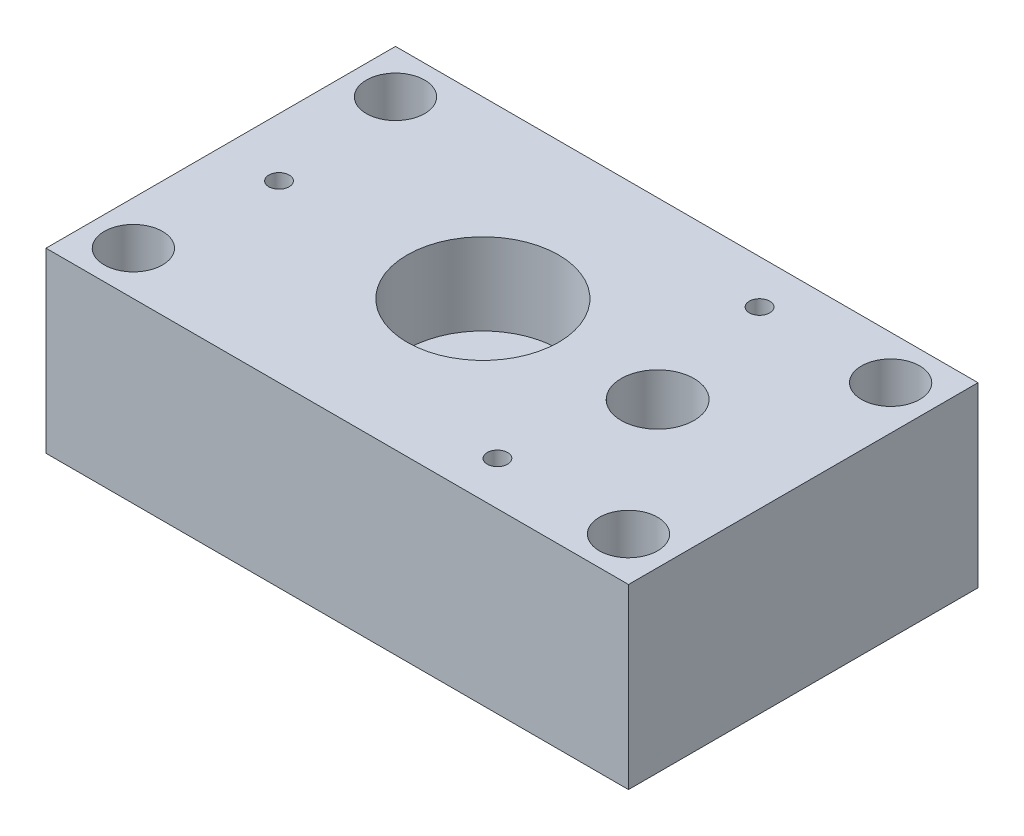
ISO-10303-21;
HEADER;
FILE_DESCRIPTION(('STEP AP214'),'2;1');
FILE_NAME('part.step','',(''),(''),'','','');
FILE_SCHEMA(('AUTOMOTIVE_DESIGN { 1 0 10303 214 1 1 1 1 }'));
ENDSEC;
DATA;
#1=APPLICATION_CONTEXT('core data for automotive mechanical design processes');
#2=APPLICATION_PROTOCOL_DEFINITION('international standard','automotive_design',2000,#1);
#3=PRODUCT_CONTEXT('',#1,'mechanical');
#4=PRODUCT('Part','Part','',(#3));
#5=PRODUCT_RELATED_PRODUCT_CATEGORY('part','',(#4));
#6=PRODUCT_DEFINITION_FORMATION('','',#4);
#7=PRODUCT_DEFINITION_CONTEXT('part definition',#1,'design');
#8=PRODUCT_DEFINITION('design','',#6,#7);
#9=PRODUCT_DEFINITION_SHAPE('','',#8);
#10=(LENGTH_UNIT() NAMED_UNIT(*) SI_UNIT(.MILLI.,.METRE.));
#11=(NAMED_UNIT(*) PLANE_ANGLE_UNIT() SI_UNIT($,.RADIAN.));
#12=(NAMED_UNIT(*) SI_UNIT($,.STERADIAN.) SOLID_ANGLE_UNIT());
#13=UNCERTAINTY_MEASURE_WITH_UNIT(LENGTH_MEASURE(1.E-05),#10,'distance_accuracy_value','');
#14=(GEOMETRIC_REPRESENTATION_CONTEXT(3) GLOBAL_UNCERTAINTY_ASSIGNED_CONTEXT((#13)) GLOBAL_UNIT_ASSIGNED_CONTEXT((#10,
#11,#12)) REPRESENTATION_CONTEXT('',''));
#15=CARTESIAN_POINT('',(0.,0.,0.));
#16=DIRECTION('',(0.,0.,1.));
#17=DIRECTION('',(1.,0.,0.));
#18=AXIS2_PLACEMENT_3D('',#15,#16,#17);
#19=CARTESIAN_POINT('',(1.5,6.1,1.5));
#20=DIRECTION('',(0.,-1.,0.));
#21=DIRECTION('',(0.,0.,-1.));
#22=AXIS2_PLACEMENT_3D('',#19,#20,#21);
#23=CYLINDRICAL_SURFACE('',#22,0.75);
#24=CARTESIAN_POINT('',(1.5,0.,1.5));
#25=DIRECTION('',(0.,1.,0.));
#26=DIRECTION('',(0.,0.,1.));
#27=AXIS2_PLACEMENT_3D('',#24,#25,#26);
#28=CIRCLE('',#27,0.75);
#29=CARTESIAN_POINT('',(1.5,0.,2.25));
#30=VERTEX_POINT('',#29);
#31=EDGE_CURVE('E265',#30,#30,#28,.T.);
#32=ORIENTED_EDGE('',*,*,#31,.F.);
#33=EDGE_LOOP('',(#32));
#34=FACE_BOUND('',#33,.T.);
#35=CARTESIAN_POINT('',(1.5,1.,1.5));
#36=DIRECTION('',(0.,1.,0.));
#37=DIRECTION('',(0.,0.,1.));
#38=AXIS2_PLACEMENT_3D('',#35,#36,#37);
#39=CIRCLE('',#38,0.75);
#40=CARTESIAN_POINT('',(1.5,1.,2.25));
#41=VERTEX_POINT('',#40);
#42=EDGE_CURVE('E131',#41,#41,#39,.T.);
#43=ORIENTED_EDGE('',*,*,#42,.T.);
#44=EDGE_LOOP('',(#43));
#45=FACE_BOUND('',#44,.T.);
#46=ADVANCED_FACE('F127',(#34,#45),#23,.F.);
#47=CARTESIAN_POINT('',(1.5,6.1,10.5));
#48=DIRECTION('',(0.,-1.,0.));
#49=DIRECTION('',(0.,0.,-1.));
#50=AXIS2_PLACEMENT_3D('',#47,#48,#49);
#51=CYLINDRICAL_SURFACE('',#50,0.75);
#52=CARTESIAN_POINT('',(1.5,0.,10.5));
#53=DIRECTION('',(0.,1.,0.));
#54=DIRECTION('',(0.,0.,1.));
#55=AXIS2_PLACEMENT_3D('',#52,#53,#54);
#56=CIRCLE('',#55,0.75);
#57=CARTESIAN_POINT('',(1.5,0.,11.25));
#58=VERTEX_POINT('',#57);
#59=EDGE_CURVE('E262',#58,#58,#56,.T.);
#60=ORIENTED_EDGE('',*,*,#59,.F.);
#61=EDGE_LOOP('',(#60));
#62=FACE_BOUND('',#61,.T.);
#63=CARTESIAN_POINT('',(1.5,1.,10.5));
#64=DIRECTION('',(0.,1.,0.));
#65=DIRECTION('',(0.,0.,1.));
#66=AXIS2_PLACEMENT_3D('',#63,#64,#65);
#67=CIRCLE('',#66,0.75);
#68=CARTESIAN_POINT('',(1.5,1.,11.25));
#69=VERTEX_POINT('',#68);
#70=EDGE_CURVE('E233',#69,#69,#67,.T.);
#71=ORIENTED_EDGE('',*,*,#70,.T.);
#72=EDGE_LOOP('',(#71));
#73=FACE_BOUND('',#72,.T.);
#74=ADVANCED_FACE('F292',(#62,#73),#51,.F.);
#75=CARTESIAN_POINT('',(18.5,6.1,1.5));
#76=DIRECTION('',(0.,-1.,0.));
#77=DIRECTION('',(0.,0.,-1.));
#78=AXIS2_PLACEMENT_3D('',#75,#76,#77);
#79=CYLINDRICAL_SURFACE('',#78,0.750000000000002);
#80=CARTESIAN_POINT('',(18.5,0.,1.5));
#81=DIRECTION('',(0.,1.,0.));
#82=DIRECTION('',(0.,0.,1.));
#83=AXIS2_PLACEMENT_3D('',#80,#81,#82);
#84=CIRCLE('',#83,0.750000000000002);
#85=CARTESIAN_POINT('',(18.5,0.,2.25));
#86=VERTEX_POINT('',#85);
#87=EDGE_CURVE('E254',#86,#86,#84,.T.);
#88=ORIENTED_EDGE('',*,*,#87,.F.);
#89=EDGE_LOOP('',(#88));
#90=FACE_BOUND('',#89,.T.);
#91=CARTESIAN_POINT('',(18.5,1.,1.5));
#92=DIRECTION('',(0.,1.,0.));
#93=DIRECTION('',(0.,0.,1.));
#94=AXIS2_PLACEMENT_3D('',#91,#92,#93);
#95=CIRCLE('',#94,0.750000000000002);
#96=CARTESIAN_POINT('',(18.5,1.,2.25));
#97=VERTEX_POINT('',#96);
#98=EDGE_CURVE('E230',#97,#97,#95,.T.);
#99=ORIENTED_EDGE('',*,*,#98,.T.);
#100=EDGE_LOOP('',(#99));
#101=FACE_BOUND('',#100,.T.);
#102=ADVANCED_FACE('F298',(#90,#101),#79,.F.);
#103=CARTESIAN_POINT('',(18.5,6.1,10.5));
#104=DIRECTION('',(0.,-1.,0.));
#105=DIRECTION('',(0.,0.,-1.));
#106=AXIS2_PLACEMENT_3D('',#103,#104,#105);
#107=CYLINDRICAL_SURFACE('',#106,0.750000000000002);
#108=CARTESIAN_POINT('',(18.5,0.,10.5));
#109=DIRECTION('',(0.,1.,0.));
#110=DIRECTION('',(0.,0.,1.));
#111=AXIS2_PLACEMENT_3D('',#108,#109,#110);
#112=CIRCLE('',#111,0.750000000000002);
#113=CARTESIAN_POINT('',(18.5,0.,11.25));
#114=VERTEX_POINT('',#113);
#115=EDGE_CURVE('E251',#114,#114,#112,.T.);
#116=ORIENTED_EDGE('',*,*,#115,.F.);
#117=EDGE_LOOP('',(#116));
#118=FACE_BOUND('',#117,.T.);
#119=CARTESIAN_POINT('',(18.5,1.,10.5));
#120=DIRECTION('',(0.,1.,0.));
#121=DIRECTION('',(0.,0.,1.));
#122=AXIS2_PLACEMENT_3D('',#119,#120,#121);
#123=CIRCLE('',#122,0.750000000000002);
#124=CARTESIAN_POINT('',(18.5,1.,11.25));
#125=VERTEX_POINT('',#124);
#126=EDGE_CURVE('E227',#125,#125,#123,.T.);
#127=ORIENTED_EDGE('',*,*,#126,.T.);
#128=EDGE_LOOP('',(#127));
#129=FACE_BOUND('',#128,.T.);
#130=ADVANCED_FACE('F304',(#118,#129),#107,.F.);
#131=CARTESIAN_POINT('',(0.,0.,0.));
#132=DIRECTION('',(0.,1.,0.));
#133=DIRECTION('',(0.,0.,1.));
#134=AXIS2_PLACEMENT_3D('',#131,#132,#133);
#135=PLANE('',#134);
#136=CARTESIAN_POINT('',(2.,0.,6.));
#137=DIRECTION('',(0.,1.,0.));
#138=DIRECTION('',(0.,0.,1.));
#139=AXIS2_PLACEMENT_3D('',#136,#137,#138);
#140=CIRCLE('',#139,0.35);
#141=CARTESIAN_POINT('',(2.,0.,6.35));
#142=VERTEX_POINT('',#141);
#143=EDGE_CURVE('E255',#142,#142,#140,.T.);
#144=ORIENTED_EDGE('',*,*,#143,.T.);
#145=EDGE_LOOP('',(#144));
#146=FACE_BOUND('',#145,.T.);
#147=ORIENTED_EDGE('',*,*,#115,.T.);
#148=EDGE_LOOP('',(#147));
#149=FACE_BOUND('',#148,.T.);
#150=ORIENTED_EDGE('',*,*,#87,.T.);
#151=EDGE_LOOP('',(#150));
#152=FACE_BOUND('',#151,.T.);
#153=ORIENTED_EDGE('',*,*,#59,.T.);
#154=EDGE_LOOP('',(#153));
#155=FACE_BOUND('',#154,.T.);
#156=CARTESIAN_POINT('',(14.,0.,1.5));
#157=DIRECTION('',(0.,1.,0.));
#158=DIRECTION('',(0.,0.,1.));
#159=AXIS2_PLACEMENT_3D('',#156,#157,#158);
#160=CIRCLE('',#159,0.350000000000001);
#161=CARTESIAN_POINT('',(14.,0.,1.85));
#162=VERTEX_POINT('',#161);
#163=EDGE_CURVE('E261',#162,#162,#160,.T.);
#164=ORIENTED_EDGE('',*,*,#163,.T.);
#165=EDGE_LOOP('',(#164));
#166=FACE_BOUND('',#165,.T.);
#167=CARTESIAN_POINT('',(14.,0.,10.5));
#168=DIRECTION('',(0.,1.,0.));
#169=DIRECTION('',(0.,0.,1.));
#170=AXIS2_PLACEMENT_3D('',#167,#168,#169);
#171=CIRCLE('',#170,0.350000000000001);
#172=CARTESIAN_POINT('',(14.,0.,10.85));
#173=VERTEX_POINT('',#172);
#174=EDGE_CURVE('E242',#173,#173,#171,.T.);
#175=ORIENTED_EDGE('',*,*,#174,.T.);
#176=EDGE_LOOP('',(#175));
#177=FACE_BOUND('',#176,.T.);
#178=ORIENTED_EDGE('',*,*,#31,.T.);
#179=EDGE_LOOP('',(#178));
#180=FACE_BOUND('',#179,.T.);
#181=DIRECTION('',(0.,0.,1.));
#182=VECTOR('',#181,1.);
#183=CARTESIAN_POINT('',(0.,0.,0.));
#184=LINE('',#183,#182);
#185=CARTESIAN_POINT('',(0.,0.,0.));
#186=VERTEX_POINT('',#185);
#187=CARTESIAN_POINT('',(0.,0.,12.));
#188=VERTEX_POINT('',#187);
#189=EDGE_CURVE('E215',#186,#188,#184,.T.);
#190=ORIENTED_EDGE('',*,*,#189,.F.);
#191=DIRECTION('',(1.,0.,0.));
#192=VECTOR('',#191,1.);
#193=CARTESIAN_POINT('',(0.,0.,0.));
#194=LINE('',#193,#192);
#195=CARTESIAN_POINT('',(20.,0.,0.));
#196=VERTEX_POINT('',#195);
#197=EDGE_CURVE('E221',#186,#196,#194,.T.);
#198=ORIENTED_EDGE('',*,*,#197,.T.);
#199=DIRECTION('',(0.,0.,1.));
#200=VECTOR('',#199,1.);
#201=CARTESIAN_POINT('',(20.,0.,0.));
#202=LINE('',#201,#200);
#203=CARTESIAN_POINT('',(20.,0.,12.));
#204=VERTEX_POINT('',#203);
#205=EDGE_CURVE('E176',#196,#204,#202,.T.);
#206=ORIENTED_EDGE('',*,*,#205,.T.);
#207=DIRECTION('',(1.,0.,0.));
#208=VECTOR('',#207,1.);
#209=CARTESIAN_POINT('',(0.,0.,12.));
#210=LINE('',#209,#208);
#211=EDGE_CURVE('E217',#188,#204,#210,.T.);
#212=ORIENTED_EDGE('',*,*,#211,.F.);
#213=EDGE_LOOP('',(#190,#198,#206,#212));
#214=FACE_BOUND('',#213,.T.);
#215=CARTESIAN_POINT('',(15.,0.,6.));
#216=DIRECTION('',(0.,1.,0.));
#217=DIRECTION('',(0.,0.,1.));
#218=AXIS2_PLACEMENT_3D('',#215,#216,#217);
#219=CIRCLE('',#218,1.25);
#220=CARTESIAN_POINT('',(15.,0.,7.25));
#221=VERTEX_POINT('',#220);
#222=EDGE_CURVE('E212',#221,#221,#219,.T.);
#223=ORIENTED_EDGE('',*,*,#222,.T.);
#224=EDGE_LOOP('',(#223));
#225=FACE_BOUND('',#224,.T.);
#226=CARTESIAN_POINT('',(9.84707986243722,0.,3.80741840382165));
#227=DIRECTION('',(0.,1.,0.));
#228=DIRECTION('',(0.,0.,1.));
#229=AXIS2_PLACEMENT_3D('',#226,#227,#228);
#230=CIRCLE('',#229,2.6);
#231=CARTESIAN_POINT('',(9.84707986243722,0.,6.40741840382165));
#232=VERTEX_POINT('',#231);
#233=EDGE_CURVE('E207',#232,#232,#230,.T.);
#234=ORIENTED_EDGE('',*,*,#233,.T.);
#235=EDGE_LOOP('',(#234));
#236=FACE_BOUND('',#235,.T.);
#237=CARTESIAN_POINT('',(7.67873609357972,0.,8.97058461265678));
#238=DIRECTION('',(0.,1.,0.));
#239=DIRECTION('',(0.,0.,1.));
#240=AXIS2_PLACEMENT_3D('',#237,#238,#239);
#241=CIRCLE('',#240,0.600000000000001);
#242=CARTESIAN_POINT('',(7.67873609357972,0.,9.57058461265678));
#243=VERTEX_POINT('',#242);
#244=EDGE_CURVE('E204',#243,#243,#241,.T.);
#245=ORIENTED_EDGE('',*,*,#244,.T.);
#246=EDGE_LOOP('',(#245));
#247=FACE_BOUND('',#246,.T.);
#248=ADVANCED_FACE('F315',(#146,#149,#152,#155,#166,#177,#180,#214,#225,#236,#247),#135,.F.);
#249=CARTESIAN_POINT('',(0.,2.8,0.));
#250=DIRECTION('',(1.,0.,0.));
#251=DIRECTION('',(0.,0.,-1.));
#252=AXIS2_PLACEMENT_3D('',#249,#250,#251);
#253=PLANE('',#252);
#254=ORIENTED_EDGE('',*,*,#189,.T.);
#255=DIRECTION('',(0.,-1.,0.));
#256=VECTOR('',#255,1.);
#257=CARTESIAN_POINT('',(0.,2.8,12.));
#258=LINE('',#257,#256);
#259=CARTESIAN_POINT('',(0.,6.1,12.));
#260=VERTEX_POINT('',#259);
#261=EDGE_CURVE('E136',#260,#188,#258,.T.);
#262=ORIENTED_EDGE('',*,*,#261,.F.);
#263=DIRECTION('',(0.,0.,-1.));
#264=VECTOR('',#263,1.);
#265=CARTESIAN_POINT('',(0.,6.1,0.));
#266=LINE('',#265,#264);
#267=CARTESIAN_POINT('',(0.,6.1,0.));
#268=VERTEX_POINT('',#267);
#269=EDGE_CURVE('E185',#260,#268,#266,.T.);
#270=ORIENTED_EDGE('',*,*,#269,.T.);
#271=DIRECTION('',(0.,-1.,0.));
#272=VECTOR('',#271,1.);
#273=CARTESIAN_POINT('',(0.,2.8,0.));
#274=LINE('',#273,#272);
#275=EDGE_CURVE('E144',#268,#186,#274,.T.);
#276=ORIENTED_EDGE('',*,*,#275,.T.);
#277=EDGE_LOOP('',(#254,#262,#270,#276));
#278=FACE_BOUND('',#277,.T.);
#279=ADVANCED_FACE('F129',(#278),#253,.F.);
#280=CARTESIAN_POINT('',(0.,2.8,12.));
#281=DIRECTION('',(0.,0.,-1.));
#282=DIRECTION('',(-1.,0.,0.));
#283=AXIS2_PLACEMENT_3D('',#280,#281,#282);
#284=PLANE('',#283);
#285=ORIENTED_EDGE('',*,*,#211,.T.);
#286=DIRECTION('',(0.,-1.,0.));
#287=VECTOR('',#286,1.);
#288=CARTESIAN_POINT('',(20.,2.8,12.));
#289=LINE('',#288,#287);
#290=CARTESIAN_POINT('',(20.,6.1,12.));
#291=VERTEX_POINT('',#290);
#292=EDGE_CURVE('E178',#291,#204,#289,.T.);
#293=ORIENTED_EDGE('',*,*,#292,.F.);
#294=DIRECTION('',(-1.,0.,0.));
#295=VECTOR('',#294,1.);
#296=CARTESIAN_POINT('',(0.,6.1,12.));
#297=LINE('',#296,#295);
#298=EDGE_CURVE('E190',#291,#260,#297,.T.);
#299=ORIENTED_EDGE('',*,*,#298,.T.);
#300=ORIENTED_EDGE('',*,*,#261,.T.);
#301=EDGE_LOOP('',(#285,#293,#299,#300));
#302=FACE_BOUND('',#301,.T.);
#303=ADVANCED_FACE('F415',(#302),#284,.F.);
#304=CARTESIAN_POINT('',(20.,2.8,0.));
#305=DIRECTION('',(1.,0.,0.));
#306=DIRECTION('',(0.,0.,-1.));
#307=AXIS2_PLACEMENT_3D('',#304,#305,#306);
#308=PLANE('',#307);
#309=ORIENTED_EDGE('',*,*,#205,.F.);
#310=DIRECTION('',(0.,-1.,0.));
#311=VECTOR('',#310,1.);
#312=CARTESIAN_POINT('',(20.,2.8,0.));
#313=LINE('',#312,#311);
#314=CARTESIAN_POINT('',(20.,6.1,0.));
#315=VERTEX_POINT('',#314);
#316=EDGE_CURVE('E152',#315,#196,#313,.T.);
#317=ORIENTED_EDGE('',*,*,#316,.F.);
#318=DIRECTION('',(0.,0.,-1.));
#319=VECTOR('',#318,1.);
#320=CARTESIAN_POINT('',(20.,6.1,0.));
#321=LINE('',#320,#319);
#322=EDGE_CURVE('E173',#291,#315,#321,.T.);
#323=ORIENTED_EDGE('',*,*,#322,.F.);
#324=ORIENTED_EDGE('',*,*,#292,.T.);
#325=EDGE_LOOP('',(#309,#317,#323,#324));
#326=FACE_BOUND('',#325,.T.);
#327=ADVANCED_FACE('F171',(#326),#308,.T.);
#328=CARTESIAN_POINT('',(0.,2.8,0.));
#329=DIRECTION('',(0.,0.,-1.));
#330=DIRECTION('',(-1.,0.,0.));
#331=AXIS2_PLACEMENT_3D('',#328,#329,#330);
#332=PLANE('',#331);
#333=ORIENTED_EDGE('',*,*,#197,.F.);
#334=ORIENTED_EDGE('',*,*,#275,.F.);
#335=DIRECTION('',(-1.,0.,0.));
#336=VECTOR('',#335,1.);
#337=CARTESIAN_POINT('',(0.,6.1,0.));
#338=LINE('',#337,#336);
#339=EDGE_CURVE('E181',#315,#268,#338,.T.);
#340=ORIENTED_EDGE('',*,*,#339,.F.);
#341=ORIENTED_EDGE('',*,*,#316,.T.);
#342=EDGE_LOOP('',(#333,#334,#340,#341));
#343=FACE_BOUND('',#342,.T.);
#344=ADVANCED_FACE('F182',(#343),#332,.T.);
#345=CARTESIAN_POINT('',(15.,2.8,6.));
#346=DIRECTION('',(0.,-1.,0.));
#347=DIRECTION('',(0.,0.,-1.));
#348=AXIS2_PLACEMENT_3D('',#345,#346,#347);
#349=CYLINDRICAL_SURFACE('',#348,1.25);
#350=ORIENTED_EDGE('',*,*,#222,.F.);
#351=EDGE_LOOP('',(#350));
#352=FACE_BOUND('',#351,.T.);
#353=CARTESIAN_POINT('',(15.,6.1,6.));
#354=DIRECTION('',(0.,1.,0.));
#355=DIRECTION('',(0.,0.,1.));
#356=AXIS2_PLACEMENT_3D('',#353,#354,#355);
#357=CIRCLE('',#356,1.25);
#358=CARTESIAN_POINT('',(15.,6.1,7.25));
#359=VERTEX_POINT('',#358);
#360=EDGE_CURVE('E194',#359,#359,#357,.T.);
#361=ORIENTED_EDGE('',*,*,#360,.T.);
#362=EDGE_LOOP('',(#361));
#363=FACE_BOUND('',#362,.T.);
#364=ADVANCED_FACE('F272',(#352,#363),#349,.F.);
#365=CARTESIAN_POINT('',(9.84707986243722,2.8,3.80741840382165));
#366=DIRECTION('',(0.,-1.,0.));
#367=DIRECTION('',(0.,0.,-1.));
#368=AXIS2_PLACEMENT_3D('',#365,#366,#367);
#369=CYLINDRICAL_SURFACE('',#368,2.6);
#370=CARTESIAN_POINT('',(9.84707986243722,2.8,3.80741840382165));
#371=DIRECTION('',(0.,1.,0.));
#372=DIRECTION('',(0.,0.,1.));
#373=AXIS2_PLACEMENT_3D('',#370,#371,#372);
#374=CIRCLE('',#373,2.6);
#375=CARTESIAN_POINT('',(9.84707986243722,2.8,6.40741840382165));
#376=VERTEX_POINT('',#375);
#377=EDGE_CURVE('E203',#376,#376,#374,.T.);
#378=ORIENTED_EDGE('',*,*,#377,.T.);
#379=EDGE_LOOP('',(#378));
#380=FACE_BOUND('',#379,.T.);
#381=ORIENTED_EDGE('',*,*,#233,.F.);
#382=EDGE_LOOP('',(#381));
#383=FACE_BOUND('',#382,.T.);
#384=ADVANCED_FACE('F401',(#380,#383),#369,.F.);
#385=CARTESIAN_POINT('',(7.67873609357972,2.8,8.97058461265678));
#386=DIRECTION('',(0.,-1.,0.));
#387=DIRECTION('',(0.,0.,-1.));
#388=AXIS2_PLACEMENT_3D('',#385,#386,#387);
#389=CYLINDRICAL_SURFACE('',#388,0.600000000000001);
#390=CARTESIAN_POINT('',(7.67873609357972,2.8,8.97058461265678));
#391=DIRECTION('',(0.,1.,0.));
#392=DIRECTION('',(0.,0.,1.));
#393=AXIS2_PLACEMENT_3D('',#390,#391,#392);
#394=CIRCLE('',#393,0.600000000000001);
#395=CARTESIAN_POINT('',(7.67873609357972,2.8,9.57058461265678));
#396=VERTEX_POINT('',#395);
#397=EDGE_CURVE('E200',#396,#396,#394,.T.);
#398=ORIENTED_EDGE('',*,*,#397,.T.);
#399=EDGE_LOOP('',(#398));
#400=FACE_BOUND('',#399,.T.);
#401=ORIENTED_EDGE('',*,*,#244,.F.);
#402=EDGE_LOOP('',(#401));
#403=FACE_BOUND('',#402,.T.);
#404=ADVANCED_FACE('F398',(#400,#403),#389,.F.);
#405=CARTESIAN_POINT('',(0.,2.8,0.));
#406=DIRECTION('',(0.,1.,0.));
#407=DIRECTION('',(0.,0.,1.));
#408=AXIS2_PLACEMENT_3D('',#405,#406,#407);
#409=PLANE('',#408);
#410=ORIENTED_EDGE('',*,*,#397,.F.);
#411=EDGE_LOOP('',(#410));
#412=FACE_BOUND('',#411,.T.);
#413=ADVANCED_FACE('F285',(#412),#409,.F.);
#414=ORIENTED_EDGE('',*,*,#377,.F.);
#415=EDGE_LOOP('',(#414));
#416=FACE_BOUND('',#415,.T.);
#417=ADVANCED_FACE('F275',(#416),#409,.F.);
#418=CARTESIAN_POINT('',(0.,6.1,0.));
#419=DIRECTION('',(0.,1.,0.));
#420=DIRECTION('',(0.,0.,1.));
#421=AXIS2_PLACEMENT_3D('',#418,#419,#420);
#422=PLANE('',#421);
#423=CARTESIAN_POINT('',(1.5,6.1,1.5));
#424=DIRECTION('',(0.,1.,0.));
#425=DIRECTION('',(0.,0.,1.));
#426=AXIS2_PLACEMENT_3D('',#423,#424,#425);
#427=CIRCLE('',#426,1.);
#428=CARTESIAN_POINT('',(1.5,6.1,2.5));
#429=VERTEX_POINT('',#428);
#430=EDGE_CURVE('E373',#429,#429,#427,.T.);
#431=ORIENTED_EDGE('',*,*,#430,.F.);
#432=EDGE_LOOP('',(#431));
#433=FACE_BOUND('',#432,.T.);
#434=CARTESIAN_POINT('',(1.5,6.1,10.5));
#435=DIRECTION('',(0.,1.,0.));
#436=DIRECTION('',(0.,0.,1.));
#437=AXIS2_PLACEMENT_3D('',#434,#435,#436);
#438=CIRCLE('',#437,1.);
#439=CARTESIAN_POINT('',(1.5,6.1,11.5));
#440=VERTEX_POINT('',#439);
#441=EDGE_CURVE('E367',#440,#440,#438,.T.);
#442=ORIENTED_EDGE('',*,*,#441,.F.);
#443=EDGE_LOOP('',(#442));
#444=FACE_BOUND('',#443,.T.);
#445=CARTESIAN_POINT('',(18.5,6.1,10.5));
#446=DIRECTION('',(0.,1.,0.));
#447=DIRECTION('',(0.,0.,1.));
#448=AXIS2_PLACEMENT_3D('',#445,#446,#447);
#449=CIRCLE('',#448,1.);
#450=CARTESIAN_POINT('',(18.5,6.1,11.5));
#451=VERTEX_POINT('',#450);
#452=EDGE_CURVE('E361',#451,#451,#449,.T.);
#453=ORIENTED_EDGE('',*,*,#452,.F.);
#454=EDGE_LOOP('',(#453));
#455=FACE_BOUND('',#454,.T.);
#456=CARTESIAN_POINT('',(18.5,6.1,1.5));
#457=DIRECTION('',(0.,1.,0.));
#458=DIRECTION('',(0.,0.,1.));
#459=AXIS2_PLACEMENT_3D('',#456,#457,#458);
#460=CIRCLE('',#459,1.);
#461=CARTESIAN_POINT('',(18.5,6.1,2.5));
#462=VERTEX_POINT('',#461);
#463=EDGE_CURVE('E363',#462,#462,#460,.T.);
#464=ORIENTED_EDGE('',*,*,#463,.F.);
#465=EDGE_LOOP('',(#464));
#466=FACE_BOUND('',#465,.T.);
#467=CARTESIAN_POINT('',(2.,6.1,6.));
#468=DIRECTION('',(0.,1.,0.));
#469=DIRECTION('',(0.,0.,1.));
#470=AXIS2_PLACEMENT_3D('',#467,#468,#469);
#471=CIRCLE('',#470,0.35);
#472=CARTESIAN_POINT('',(2.,6.1,6.35));
#473=VERTEX_POINT('',#472);
#474=EDGE_CURVE('E258',#473,#473,#471,.T.);
#475=ORIENTED_EDGE('',*,*,#474,.F.);
#476=EDGE_LOOP('',(#475));
#477=FACE_BOUND('',#476,.T.);
#478=CARTESIAN_POINT('',(14.,6.1,1.5));
#479=DIRECTION('',(0.,1.,0.));
#480=DIRECTION('',(0.,0.,1.));
#481=AXIS2_PLACEMENT_3D('',#478,#479,#480);
#482=CIRCLE('',#481,0.350000000000001);
#483=CARTESIAN_POINT('',(14.,6.1,1.85));
#484=VERTEX_POINT('',#483);
#485=EDGE_CURVE('E247',#484,#484,#482,.T.);
#486=ORIENTED_EDGE('',*,*,#485,.F.);
#487=EDGE_LOOP('',(#486));
#488=FACE_BOUND('',#487,.T.);
#489=CARTESIAN_POINT('',(14.,6.1,10.5));
#490=DIRECTION('',(0.,1.,0.));
#491=DIRECTION('',(0.,0.,1.));
#492=AXIS2_PLACEMENT_3D('',#489,#490,#491);
#493=CIRCLE('',#492,0.350000000000001);
#494=CARTESIAN_POINT('',(14.,6.1,10.85));
#495=VERTEX_POINT('',#494);
#496=EDGE_CURVE('E238',#495,#495,#493,.T.);
#497=ORIENTED_EDGE('',*,*,#496,.F.);
#498=EDGE_LOOP('',(#497));
#499=FACE_BOUND('',#498,.T.);
#500=CARTESIAN_POINT('',(9.,6.1,6.));
#501=DIRECTION('',(0.,1.,0.));
#502=DIRECTION('',(0.,0.,1.));
#503=AXIS2_PLACEMENT_3D('',#500,#501,#502);
#504=CIRCLE('',#503,2.6);
#505=CARTESIAN_POINT('',(9.,6.1,8.6));
#506=VERTEX_POINT('',#505);
#507=EDGE_CURVE('E191',#506,#506,#504,.T.);
#508=ORIENTED_EDGE('',*,*,#507,.F.);
#509=EDGE_LOOP('',(#508));
#510=FACE_BOUND('',#509,.T.);
#511=ORIENTED_EDGE('',*,*,#322,.T.);
#512=ORIENTED_EDGE('',*,*,#339,.T.);
#513=ORIENTED_EDGE('',*,*,#269,.F.);
#514=ORIENTED_EDGE('',*,*,#298,.F.);
#515=EDGE_LOOP('',(#511,#512,#513,#514));
#516=FACE_BOUND('',#515,.T.);
#517=ORIENTED_EDGE('',*,*,#360,.F.);
#518=EDGE_LOOP('',(#517));
#519=FACE_BOUND('',#518,.T.);
#520=ADVANCED_FACE('F187',(#433,#444,#455,#466,#477,#488,#499,#510,#516,#519),#422,.T.);
#521=CARTESIAN_POINT('',(9.,6.1,6.));
#522=DIRECTION('',(0.,-1.,0.));
#523=DIRECTION('',(0.,0.,-1.));
#524=AXIS2_PLACEMENT_3D('',#521,#522,#523);
#525=CYLINDRICAL_SURFACE('',#524,2.6);
#526=ORIENTED_EDGE('',*,*,#507,.T.);
#527=EDGE_LOOP('',(#526));
#528=FACE_BOUND('',#527,.T.);
#529=CARTESIAN_POINT('',(9.,3.3,6.));
#530=DIRECTION('',(0.,1.,0.));
#531=DIRECTION('',(0.,0.,1.));
#532=AXIS2_PLACEMENT_3D('',#529,#530,#531);
#533=CIRCLE('',#532,2.6);
#534=CARTESIAN_POINT('',(9.,3.3,8.6));
#535=VERTEX_POINT('',#534);
#536=EDGE_CURVE('E13',#535,#535,#533,.F.);
#537=ORIENTED_EDGE('',*,*,#536,.T.);
#538=EDGE_LOOP('',(#537));
#539=FACE_BOUND('',#538,.T.);
#540=ADVANCED_FACE('F274',(#528,#539),#525,.F.);
#541=CARTESIAN_POINT('',(0.,3.3,0.));
#542=DIRECTION('',(0.,1.,0.));
#543=DIRECTION('',(0.,0.,1.));
#544=AXIS2_PLACEMENT_3D('',#541,#542,#543);
#545=PLANE('',#544);
#546=ORIENTED_EDGE('',*,*,#536,.F.);
#547=EDGE_LOOP('',(#546));
#548=FACE_BOUND('',#547,.T.);
#549=ADVANCED_FACE('F282',(#548),#545,.T.);
#550=CARTESIAN_POINT('',(14.,6.1,10.5));
#551=DIRECTION('',(0.,-1.,0.));
#552=DIRECTION('',(0.,0.,-1.));
#553=AXIS2_PLACEMENT_3D('',#550,#551,#552);
#554=CYLINDRICAL_SURFACE('',#553,0.350000000000001);
#555=ORIENTED_EDGE('',*,*,#496,.T.);
#556=EDGE_LOOP('',(#555));
#557=FACE_BOUND('',#556,.T.);
#558=ORIENTED_EDGE('',*,*,#174,.F.);
#559=EDGE_LOOP('',(#558));
#560=FACE_BOUND('',#559,.T.);
#561=ADVANCED_FACE('F317',(#557,#560),#554,.F.);
#562=CARTESIAN_POINT('',(14.,6.1,1.5));
#563=DIRECTION('',(0.,-1.,0.));
#564=DIRECTION('',(0.,0.,-1.));
#565=AXIS2_PLACEMENT_3D('',#562,#563,#564);
#566=CYLINDRICAL_SURFACE('',#565,0.350000000000001);
#567=ORIENTED_EDGE('',*,*,#485,.T.);
#568=EDGE_LOOP('',(#567));
#569=FACE_BOUND('',#568,.T.);
#570=ORIENTED_EDGE('',*,*,#163,.F.);
#571=EDGE_LOOP('',(#570));
#572=FACE_BOUND('',#571,.T.);
#573=ADVANCED_FACE('F311',(#569,#572),#566,.F.);
#574=CARTESIAN_POINT('',(2.,6.1,6.));
#575=DIRECTION('',(0.,-1.,0.));
#576=DIRECTION('',(0.,0.,-1.));
#577=AXIS2_PLACEMENT_3D('',#574,#575,#576);
#578=CYLINDRICAL_SURFACE('',#577,0.35);
#579=ORIENTED_EDGE('',*,*,#474,.T.);
#580=EDGE_LOOP('',(#579));
#581=FACE_BOUND('',#580,.T.);
#582=ORIENTED_EDGE('',*,*,#143,.F.);
#583=EDGE_LOOP('',(#582));
#584=FACE_BOUND('',#583,.T.);
#585=ADVANCED_FACE('F307',(#581,#584),#578,.F.);
#586=CARTESIAN_POINT('',(18.5,-2.8284271247462,10.5));
#587=DIRECTION('',(0.,1.,0.));
#588=DIRECTION('',(0.,0.,1.));
#589=AXIS2_PLACEMENT_3D('',#586,#587,#588);
#590=CYLINDRICAL_SURFACE('',#589,1.);
#591=CARTESIAN_POINT('',(18.5,1.,10.5));
#592=DIRECTION('',(0.,1.,0.));
#593=DIRECTION('',(0.,0.,1.));
#594=AXIS2_PLACEMENT_3D('',#591,#592,#593);
#595=CIRCLE('',#594,1.);
#596=CARTESIAN_POINT('',(18.5,1.,11.5));
#597=VERTEX_POINT('',#596);
#598=EDGE_CURVE('E358',#597,#597,#595,.F.);
#599=ORIENTED_EDGE('',*,*,#598,.T.);
#600=EDGE_LOOP('',(#599));
#601=FACE_BOUND('',#600,.T.);
#602=ORIENTED_EDGE('',*,*,#452,.T.);
#603=EDGE_LOOP('',(#602));
#604=FACE_BOUND('',#603,.T.);
#605=ADVANCED_FACE('F310',(#601,#604),#590,.F.);
#606=CARTESIAN_POINT('',(0.,1.,0.));
#607=DIRECTION('',(0.,1.,0.));
#608=DIRECTION('',(0.,0.,1.));
#609=AXIS2_PLACEMENT_3D('',#606,#607,#608);
#610=PLANE('',#609);
#611=ORIENTED_EDGE('',*,*,#126,.F.);
#612=EDGE_LOOP('',(#611));
#613=FACE_BOUND('',#612,.T.);
#614=ORIENTED_EDGE('',*,*,#598,.F.);
#615=EDGE_LOOP('',(#614));
#616=FACE_BOUND('',#615,.T.);
#617=ADVANCED_FACE('F327',(#613,#616),#610,.T.);
#618=CARTESIAN_POINT('',(18.5,-2.8284271247462,1.5));
#619=DIRECTION('',(0.,1.,0.));
#620=DIRECTION('',(0.,0.,1.));
#621=AXIS2_PLACEMENT_3D('',#618,#619,#620);
#622=CYLINDRICAL_SURFACE('',#621,1.);
#623=CARTESIAN_POINT('',(18.5,1.,1.5));
#624=DIRECTION('',(0.,1.,0.));
#625=DIRECTION('',(0.,0.,1.));
#626=AXIS2_PLACEMENT_3D('',#623,#624,#625);
#627=CIRCLE('',#626,1.);
#628=CARTESIAN_POINT('',(18.5,1.,2.5));
#629=VERTEX_POINT('',#628);
#630=EDGE_CURVE('E231',#629,#629,#627,.F.);
#631=ORIENTED_EDGE('',*,*,#630,.T.);
#632=EDGE_LOOP('',(#631));
#633=FACE_BOUND('',#632,.T.);
#634=ORIENTED_EDGE('',*,*,#463,.T.);
#635=EDGE_LOOP('',(#634));
#636=FACE_BOUND('',#635,.T.);
#637=ADVANCED_FACE('F323',(#633,#636),#622,.F.);
#638=CARTESIAN_POINT('',(0.,1.,0.));
#639=DIRECTION('',(0.,1.,0.));
#640=DIRECTION('',(0.,0.,1.));
#641=AXIS2_PLACEMENT_3D('',#638,#639,#640);
#642=PLANE('',#641);
#643=ORIENTED_EDGE('',*,*,#98,.F.);
#644=EDGE_LOOP('',(#643));
#645=FACE_BOUND('',#644,.T.);
#646=ORIENTED_EDGE('',*,*,#630,.F.);
#647=EDGE_LOOP('',(#646));
#648=FACE_BOUND('',#647,.T.);
#649=ADVANCED_FACE('F326',(#645,#648),#642,.T.);
#650=CARTESIAN_POINT('',(1.5,-2.8284271247462,10.5));
#651=DIRECTION('',(0.,1.,0.));
#652=DIRECTION('',(0.,0.,1.));
#653=AXIS2_PLACEMENT_3D('',#650,#651,#652);
#654=CYLINDRICAL_SURFACE('',#653,1.);
#655=CARTESIAN_POINT('',(1.5,1.,10.5));
#656=DIRECTION('',(0.,1.,0.));
#657=DIRECTION('',(0.,0.,1.));
#658=AXIS2_PLACEMENT_3D('',#655,#656,#657);
#659=CIRCLE('',#658,1.);
#660=CARTESIAN_POINT('',(1.5,1.,11.5));
#661=VERTEX_POINT('',#660);
#662=EDGE_CURVE('E370',#661,#661,#659,.F.);
#663=ORIENTED_EDGE('',*,*,#662,.T.);
#664=EDGE_LOOP('',(#663));
#665=FACE_BOUND('',#664,.T.);
#666=ORIENTED_EDGE('',*,*,#441,.T.);
#667=EDGE_LOOP('',(#666));
#668=FACE_BOUND('',#667,.T.);
#669=ADVANCED_FACE('F331',(#665,#668),#654,.F.);
#670=CARTESIAN_POINT('',(0.,1.,0.));
#671=DIRECTION('',(0.,1.,0.));
#672=DIRECTION('',(0.,0.,1.));
#673=AXIS2_PLACEMENT_3D('',#670,#671,#672);
#674=PLANE('',#673);
#675=ORIENTED_EDGE('',*,*,#70,.F.);
#676=EDGE_LOOP('',(#675));
#677=FACE_BOUND('',#676,.T.);
#678=ORIENTED_EDGE('',*,*,#662,.F.);
#679=EDGE_LOOP('',(#678));
#680=FACE_BOUND('',#679,.T.);
#681=ADVANCED_FACE('F340',(#677,#680),#674,.T.);
#682=CARTESIAN_POINT('',(1.5,-2.8284271247462,1.5));
#683=DIRECTION('',(0.,1.,0.));
#684=DIRECTION('',(0.,0.,1.));
#685=AXIS2_PLACEMENT_3D('',#682,#683,#684);
#686=CYLINDRICAL_SURFACE('',#685,1.);
#687=CARTESIAN_POINT('',(1.5,1.,1.5));
#688=DIRECTION('',(0.,1.,0.));
#689=DIRECTION('',(0.,0.,1.));
#690=AXIS2_PLACEMENT_3D('',#687,#688,#689);
#691=CIRCLE('',#690,1.);
#692=CARTESIAN_POINT('',(1.5,1.,2.5));
#693=VERTEX_POINT('',#692);
#694=EDGE_CURVE('E376',#693,#693,#691,.F.);
#695=ORIENTED_EDGE('',*,*,#694,.T.);
#696=EDGE_LOOP('',(#695));
#697=FACE_BOUND('',#696,.T.);
#698=ORIENTED_EDGE('',*,*,#430,.T.);
#699=EDGE_LOOP('',(#698));
#700=FACE_BOUND('',#699,.T.);
#701=ADVANCED_FACE('F336',(#697,#700),#686,.F.);
#702=CARTESIAN_POINT('',(0.,1.,0.));
#703=DIRECTION('',(0.,1.,0.));
#704=DIRECTION('',(0.,0.,1.));
#705=AXIS2_PLACEMENT_3D('',#702,#703,#704);
#706=PLANE('',#705);
#707=ORIENTED_EDGE('',*,*,#42,.F.);
#708=EDGE_LOOP('',(#707));
#709=FACE_BOUND('',#708,.T.);
#710=ORIENTED_EDGE('',*,*,#694,.F.);
#711=EDGE_LOOP('',(#710));
#712=FACE_BOUND('',#711,.T.);
#713=ADVANCED_FACE('F333',(#709,#712),#706,.T.);
#714=CLOSED_SHELL('',(#46,#74,#102,#130,#248,#279,#303,#327,#344,#364,#384,#404,#413,#417,#520,
#540,#549,#561,#573,#585,#605,#617,#637,#649,#669,#681,#701,#713));
#715=MANIFOLD_SOLID_BREP('B2',#714);
#716=ADVANCED_BREP_SHAPE_REPRESENTATION('',(#18,#715),#14);
#717=SHAPE_DEFINITION_REPRESENTATION(#9,#716);
ENDSEC;
END-ISO-10303-21;
